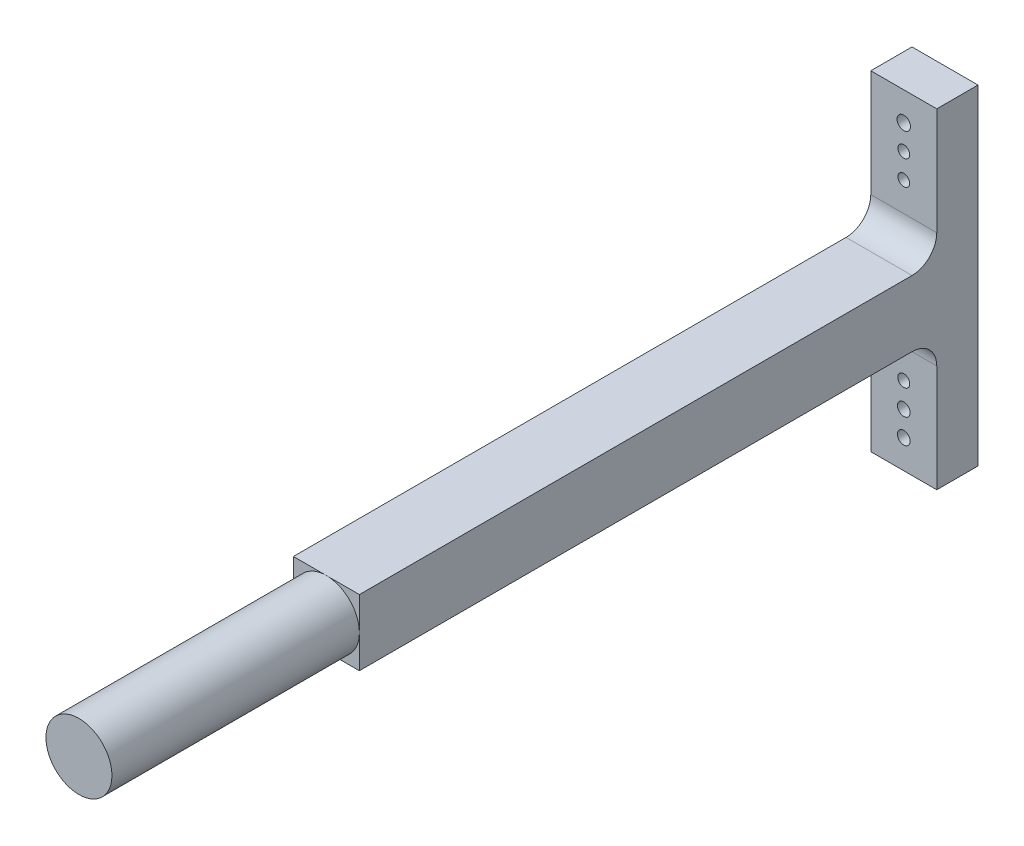
ISO-10303-21;
HEADER;
FILE_DESCRIPTION(('STEP AP214'),'2;1');
FILE_NAME('part.step','',(''),(''),'','','');
FILE_SCHEMA(('AUTOMOTIVE_DESIGN { 1 0 10303 214 1 1 1 1 }'));
ENDSEC;
DATA;
#1=APPLICATION_CONTEXT('core data for automotive mechanical design processes');
#2=APPLICATION_PROTOCOL_DEFINITION('international standard','automotive_design',2000,#1);
#3=PRODUCT_CONTEXT('',#1,'mechanical');
#4=PRODUCT('Part','Part','',(#3));
#5=PRODUCT_RELATED_PRODUCT_CATEGORY('part','',(#4));
#6=PRODUCT_DEFINITION_FORMATION('','',#4);
#7=PRODUCT_DEFINITION_CONTEXT('part definition',#1,'design');
#8=PRODUCT_DEFINITION('design','',#6,#7);
#9=PRODUCT_DEFINITION_SHAPE('','',#8);
#10=(LENGTH_UNIT() NAMED_UNIT(*) SI_UNIT(.MILLI.,.METRE.));
#11=(NAMED_UNIT(*) PLANE_ANGLE_UNIT() SI_UNIT($,.RADIAN.));
#12=(NAMED_UNIT(*) SI_UNIT($,.STERADIAN.) SOLID_ANGLE_UNIT());
#13=UNCERTAINTY_MEASURE_WITH_UNIT(LENGTH_MEASURE(1.E-05),#10,'distance_accuracy_value','');
#14=(GEOMETRIC_REPRESENTATION_CONTEXT(3) GLOBAL_UNCERTAINTY_ASSIGNED_CONTEXT((#13)) GLOBAL_UNIT_ASSIGNED_CONTEXT((#10,
#11,#12)) REPRESENTATION_CONTEXT('',''));
#15=CARTESIAN_POINT('',(0.,0.,0.));
#16=DIRECTION('',(0.,0.,1.));
#17=DIRECTION('',(1.,0.,0.));
#18=AXIS2_PLACEMENT_3D('',#15,#16,#17);
#19=CARTESIAN_POINT('',(0.,0.,75.));
#20=DIRECTION('',(0.,0.,1.));
#21=DIRECTION('',(1.,0.,0.));
#22=AXIS2_PLACEMENT_3D('',#19,#20,#21);
#23=PLANE('',#22);
#24=CARTESIAN_POINT('',(4.,20.,75.));
#25=DIRECTION('',(0.,0.,1.));
#26=DIRECTION('',(1.,0.,0.));
#27=AXIS2_PLACEMENT_3D('',#24,#25,#26);
#28=CIRCLE('',#27,4.);
#29=CARTESIAN_POINT('',(8.,20.,75.));
#30=VERTEX_POINT('',#29);
#31=CARTESIAN_POINT('',(4.,24.,75.));
#32=VERTEX_POINT('',#31);
#33=EDGE_CURVE('E142',#30,#32,#28,.T.);
#34=ORIENTED_EDGE('',*,*,#33,.F.);
#35=DIRECTION('',(0.,1.,0.));
#36=VECTOR('',#35,1.);
#37=CARTESIAN_POINT('',(8.,24.,75.));
#38=LINE('',#37,#36);
#39=CARTESIAN_POINT('',(8.,24.,75.));
#40=VERTEX_POINT('',#39);
#41=EDGE_CURVE('E130',#30,#40,#38,.T.);
#42=ORIENTED_EDGE('',*,*,#41,.T.);
#43=DIRECTION('',(-1.,0.,0.));
#44=VECTOR('',#43,1.);
#45=CARTESIAN_POINT('',(0.,24.,75.));
#46=LINE('',#45,#44);
#47=EDGE_CURVE('E143',#40,#32,#46,.T.);
#48=ORIENTED_EDGE('',*,*,#47,.T.);
#49=EDGE_LOOP('',(#34,#42,#48));
#50=FACE_BOUND('',#49,.T.);
#51=ADVANCED_FACE('F32',(#50),#23,.T.);
#52=CARTESIAN_POINT('',(0.,20.,75.));
#53=VERTEX_POINT('',#52);
#54=EDGE_CURVE('E149',#32,#53,#28,.T.);
#55=ORIENTED_EDGE('',*,*,#54,.F.);
#56=CARTESIAN_POINT('',(0.,24.,75.));
#57=VERTEX_POINT('',#56);
#58=EDGE_CURVE('E129',#32,#57,#46,.T.);
#59=ORIENTED_EDGE('',*,*,#58,.T.);
#60=DIRECTION('',(0.,-1.,0.));
#61=VECTOR('',#60,1.);
#62=CARTESIAN_POINT('',(0.,24.,75.));
#63=LINE('',#62,#61);
#64=EDGE_CURVE('E160',#57,#53,#63,.T.);
#65=ORIENTED_EDGE('',*,*,#64,.T.);
#66=EDGE_LOOP('',(#55,#59,#65));
#67=FACE_BOUND('',#66,.T.);
#68=ADVANCED_FACE('F273',(#67),#23,.T.);
#69=CARTESIAN_POINT('',(4.,16.,75.));
#70=VERTEX_POINT('',#69);
#71=EDGE_CURVE('E152',#53,#70,#28,.T.);
#72=ORIENTED_EDGE('',*,*,#71,.F.);
#73=CARTESIAN_POINT('',(0.,16.,75.));
#74=VERTEX_POINT('',#73);
#75=EDGE_CURVE('E163',#53,#74,#63,.T.);
#76=ORIENTED_EDGE('',*,*,#75,.T.);
#77=DIRECTION('',(1.,0.,0.));
#78=VECTOR('',#77,1.);
#79=CARTESIAN_POINT('',(0.,16.,75.));
#80=LINE('',#79,#78);
#81=EDGE_CURVE('E140',#74,#70,#80,.T.);
#82=ORIENTED_EDGE('',*,*,#81,.T.);
#83=EDGE_LOOP('',(#72,#76,#82));
#84=FACE_BOUND('',#83,.T.);
#85=ADVANCED_FACE('F289',(#84),#23,.T.);
#86=CARTESIAN_POINT('',(0.,0.,5.));
#87=DIRECTION('',(0.,0.,-1.));
#88=DIRECTION('',(-1.,0.,0.));
#89=AXIS2_PLACEMENT_3D('',#86,#87,#88);
#90=PLANE('',#89);
#91=CARTESIAN_POINT('',(3.99999999999987,30.5300000000001,5.));
#92=DIRECTION('',(0.,0.,1.));
#93=DIRECTION('',(1.,0.,0.));
#94=AXIS2_PLACEMENT_3D('',#91,#92,#93);
#95=CIRCLE('',#94,0.707209461962513);
#96=CARTESIAN_POINT('',(4.70720946196238,30.5300000000001,5.));
#97=VERTEX_POINT('',#96);
#98=EDGE_CURVE('E352',#97,#97,#95,.T.);
#99=ORIENTED_EDGE('',*,*,#98,.F.);
#100=EDGE_LOOP('',(#99));
#101=FACE_BOUND('',#100,.T.);
#102=CARTESIAN_POINT('',(3.99999999999984,33.5300000000001,5.));
#103=DIRECTION('',(0.,0.,1.));
#104=DIRECTION('',(1.,0.,0.));
#105=AXIS2_PLACEMENT_3D('',#102,#103,#104);
#106=CIRCLE('',#105,0.715862797432076);
#107=CARTESIAN_POINT('',(4.71586279743191,33.5300000000001,5.));
#108=VERTEX_POINT('',#107);
#109=EDGE_CURVE('E350',#108,#108,#106,.T.);
#110=ORIENTED_EDGE('',*,*,#109,.F.);
#111=EDGE_LOOP('',(#110));
#112=FACE_BOUND('',#111,.T.);
#113=CARTESIAN_POINT('',(3.99999999999981,36.5300000000001,5.));
#114=DIRECTION('',(0.,0.,1.));
#115=DIRECTION('',(1.,0.,0.));
#116=AXIS2_PLACEMENT_3D('',#113,#114,#115);
#117=CIRCLE('',#116,0.81261434625534);
#118=CARTESIAN_POINT('',(4.81261434625515,36.5300000000001,5.));
#119=VERTEX_POINT('',#118);
#120=EDGE_CURVE('E348',#119,#119,#117,.T.);
#121=ORIENTED_EDGE('',*,*,#120,.F.);
#122=EDGE_LOOP('',(#121));
#123=FACE_BOUND('',#122,.T.);
#124=DIRECTION('',(0.,-1.,0.));
#125=VECTOR('',#124,1.);
#126=CARTESIAN_POINT('',(0.,0.,5.));
#127=LINE('',#126,#125);
#128=CARTESIAN_POINT('',(0.,40.,5.));
#129=VERTEX_POINT('',#128);
#130=CARTESIAN_POINT('',(0.,27.,5.));
#131=VERTEX_POINT('',#130);
#132=EDGE_CURVE('E176',#129,#131,#127,.T.);
#133=ORIENTED_EDGE('',*,*,#132,.T.);
#134=DIRECTION('',(-1.,0.,0.));
#135=VECTOR('',#134,1.);
#136=CARTESIAN_POINT('',(8.,27.,5.));
#137=LINE('',#136,#135);
#138=CARTESIAN_POINT('',(8.,27.,5.));
#139=VERTEX_POINT('',#138);
#140=EDGE_CURVE('E53',#131,#139,#137,.F.);
#141=ORIENTED_EDGE('',*,*,#140,.T.);
#142=DIRECTION('',(0.,1.,0.));
#143=VECTOR('',#142,1.);
#144=CARTESIAN_POINT('',(8.,0.,5.));
#145=LINE('',#144,#143);
#146=CARTESIAN_POINT('',(8.,40.,5.));
#147=VERTEX_POINT('',#146);
#148=EDGE_CURVE('E181',#139,#147,#145,.T.);
#149=ORIENTED_EDGE('',*,*,#148,.T.);
#150=DIRECTION('',(-1.,0.,0.));
#151=VECTOR('',#150,1.);
#152=CARTESIAN_POINT('',(0.,40.,5.));
#153=LINE('',#152,#151);
#154=EDGE_CURVE('E185',#147,#129,#153,.T.);
#155=ORIENTED_EDGE('',*,*,#154,.T.);
#156=EDGE_LOOP('',(#133,#141,#149,#155));
#157=FACE_BOUND('',#156,.T.);
#158=ADVANCED_FACE('F263',(#101,#112,#123,#157),#90,.F.);
#159=CARTESIAN_POINT('',(4.00000000000015,3.47000000000006,5.));
#160=DIRECTION('',(0.,0.,1.));
#161=DIRECTION('',(1.,0.,0.));
#162=AXIS2_PLACEMENT_3D('',#159,#160,#161);
#163=CIRCLE('',#162,0.77356554783821);
#164=CARTESIAN_POINT('',(4.77356554783836,3.47000000000006,5.));
#165=VERTEX_POINT('',#164);
#166=EDGE_CURVE('E207',#165,#165,#163,.T.);
#167=ORIENTED_EDGE('',*,*,#166,.F.);
#168=EDGE_LOOP('',(#167));
#169=FACE_BOUND('',#168,.T.);
#170=CARTESIAN_POINT('',(4.00000000000012,6.47000000000006,5.));
#171=DIRECTION('',(0.,0.,1.));
#172=DIRECTION('',(1.,0.,0.));
#173=AXIS2_PLACEMENT_3D('',#170,#171,#172);
#174=CIRCLE('',#173,0.768304054392614);
#175=CARTESIAN_POINT('',(4.76830405439273,6.47000000000006,5.));
#176=VERTEX_POINT('',#175);
#177=EDGE_CURVE('E360',#176,#176,#174,.T.);
#178=ORIENTED_EDGE('',*,*,#177,.F.);
#179=EDGE_LOOP('',(#178));
#180=FACE_BOUND('',#179,.T.);
#181=CARTESIAN_POINT('',(4.00000000000009,9.47000000000006,5.));
#182=DIRECTION('',(0.,0.,1.));
#183=DIRECTION('',(1.,0.,0.));
#184=AXIS2_PLACEMENT_3D('',#181,#182,#183);
#185=CIRCLE('',#184,0.726526648407679);
#186=CARTESIAN_POINT('',(4.72652664840776,9.47000000000006,5.));
#187=VERTEX_POINT('',#186);
#188=EDGE_CURVE('E357',#187,#187,#185,.T.);
#189=ORIENTED_EDGE('',*,*,#188,.F.);
#190=EDGE_LOOP('',(#189));
#191=FACE_BOUND('',#190,.T.);
#192=CARTESIAN_POINT('',(8.,0.,5.));
#193=VERTEX_POINT('',#192);
#194=CARTESIAN_POINT('',(8.,13.,5.));
#195=VERTEX_POINT('',#194);
#196=EDGE_CURVE('E182',#193,#195,#145,.T.);
#197=ORIENTED_EDGE('',*,*,#196,.T.);
#198=DIRECTION('',(1.,0.,0.));
#199=VECTOR('',#198,1.);
#200=CARTESIAN_POINT('',(0.,13.,5.));
#201=LINE('',#200,#199);
#202=CARTESIAN_POINT('',(0.,13.,5.));
#203=VERTEX_POINT('',#202);
#204=EDGE_CURVE('E224',#195,#203,#201,.F.);
#205=ORIENTED_EDGE('',*,*,#204,.T.);
#206=CARTESIAN_POINT('',(0.,0.,5.));
#207=VERTEX_POINT('',#206);
#208=EDGE_CURVE('E179',#203,#207,#127,.T.);
#209=ORIENTED_EDGE('',*,*,#208,.T.);
#210=DIRECTION('',(1.,0.,0.));
#211=VECTOR('',#210,1.);
#212=CARTESIAN_POINT('',(0.,0.,5.));
#213=LINE('',#212,#211);
#214=EDGE_CURVE('E178',#207,#193,#213,.T.);
#215=ORIENTED_EDGE('',*,*,#214,.T.);
#216=EDGE_LOOP('',(#197,#205,#209,#215));
#217=FACE_BOUND('',#216,.T.);
#218=ADVANCED_FACE('F248',(#169,#180,#191,#217),#90,.F.);
#219=CARTESIAN_POINT('',(0.,0.,5.));
#220=DIRECTION('',(1.,0.,0.));
#221=DIRECTION('',(0.,0.,-1.));
#222=AXIS2_PLACEMENT_3D('',#219,#220,#221);
#223=PLANE('',#222);
#224=DIRECTION('',(0.,-1.,0.));
#225=VECTOR('',#224,1.);
#226=CARTESIAN_POINT('',(0.,0.,0.));
#227=LINE('',#226,#225);
#228=CARTESIAN_POINT('',(0.,40.,0.));
#229=VERTEX_POINT('',#228);
#230=CARTESIAN_POINT('',(0.,0.,0.));
#231=VERTEX_POINT('',#230);
#232=EDGE_CURVE('E175',#229,#231,#227,.T.);
#233=ORIENTED_EDGE('',*,*,#232,.T.);
#234=DIRECTION('',(0.,0.,-1.));
#235=VECTOR('',#234,1.);
#236=CARTESIAN_POINT('',(0.,0.,5.));
#237=LINE('',#236,#235);
#238=EDGE_CURVE('E153',#207,#231,#237,.T.);
#239=ORIENTED_EDGE('',*,*,#238,.F.);
#240=ORIENTED_EDGE('',*,*,#208,.F.);
#241=CARTESIAN_POINT('',(0.,13.,8.00000000000001));
#242=DIRECTION('',(1.,0.,0.));
#243=DIRECTION('',(0.,0.,-1.));
#244=AXIS2_PLACEMENT_3D('',#241,#242,#243);
#245=CIRCLE('',#244,3.);
#246=CARTESIAN_POINT('',(0.,16.,8.00000000000001));
#247=VERTEX_POINT('',#246);
#248=EDGE_CURVE('E232',#203,#247,#245,.T.);
#249=ORIENTED_EDGE('',*,*,#248,.T.);
#250=DIRECTION('',(0.,0.,-1.));
#251=VECTOR('',#250,1.);
#252=CARTESIAN_POINT('',(0.,16.,75.));
#253=LINE('',#252,#251);
#254=EDGE_CURVE('E172',#74,#247,#253,.T.);
#255=ORIENTED_EDGE('',*,*,#254,.F.);
#256=ORIENTED_EDGE('',*,*,#75,.F.);
#257=ORIENTED_EDGE('',*,*,#64,.F.);
#258=DIRECTION('',(0.,0.,-1.));
#259=VECTOR('',#258,1.);
#260=CARTESIAN_POINT('',(0.,24.,75.));
#261=LINE('',#260,#259);
#262=CARTESIAN_POINT('',(0.,24.,8.00000000000001));
#263=VERTEX_POINT('',#262);
#264=EDGE_CURVE('E167',#57,#263,#261,.T.);
#265=ORIENTED_EDGE('',*,*,#264,.T.);
#266=CARTESIAN_POINT('',(0.,27.,8.00000000000001));
#267=DIRECTION('',(1.,0.,0.));
#268=DIRECTION('',(0.,0.,-1.));
#269=AXIS2_PLACEMENT_3D('',#266,#267,#268);
#270=CIRCLE('',#269,3.);
#271=EDGE_CURVE('E40',#263,#131,#270,.T.);
#272=ORIENTED_EDGE('',*,*,#271,.T.);
#273=ORIENTED_EDGE('',*,*,#132,.F.);
#274=DIRECTION('',(0.,0.,-1.));
#275=VECTOR('',#274,1.);
#276=CARTESIAN_POINT('',(0.,40.,5.));
#277=LINE('',#276,#275);
#278=EDGE_CURVE('E187',#129,#229,#277,.T.);
#279=ORIENTED_EDGE('',*,*,#278,.T.);
#280=EDGE_LOOP('',(#233,#239,#240,#249,#255,#256,#257,#265,#272,#273,#279));
#281=FACE_BOUND('',#280,.T.);
#282=ADVANCED_FACE('F236',(#281),#223,.F.);
#283=CARTESIAN_POINT('',(0.,0.,5.));
#284=DIRECTION('',(0.,1.,0.));
#285=DIRECTION('',(0.,0.,1.));
#286=AXIS2_PLACEMENT_3D('',#283,#284,#285);
#287=PLANE('',#286);
#288=DIRECTION('',(1.,0.,0.));
#289=VECTOR('',#288,1.);
#290=CARTESIAN_POINT('',(0.,0.,0.));
#291=LINE('',#290,#289);
#292=CARTESIAN_POINT('',(8.,0.,0.));
#293=VERTEX_POINT('',#292);
#294=EDGE_CURVE('E190',#231,#293,#291,.T.);
#295=ORIENTED_EDGE('',*,*,#294,.T.);
#296=DIRECTION('',(0.,0.,-1.));
#297=VECTOR('',#296,1.);
#298=CARTESIAN_POINT('',(8.,0.,5.));
#299=LINE('',#298,#297);
#300=EDGE_CURVE('E155',#193,#293,#299,.T.);
#301=ORIENTED_EDGE('',*,*,#300,.F.);
#302=ORIENTED_EDGE('',*,*,#214,.F.);
#303=ORIENTED_EDGE('',*,*,#238,.T.);
#304=EDGE_LOOP('',(#295,#301,#302,#303));
#305=FACE_BOUND('',#304,.T.);
#306=ADVANCED_FACE('F252',(#305),#287,.F.);
#307=CARTESIAN_POINT('',(8.,0.,5.));
#308=DIRECTION('',(-1.,0.,0.));
#309=DIRECTION('',(0.,0.,1.));
#310=AXIS2_PLACEMENT_3D('',#307,#308,#309);
#311=PLANE('',#310);
#312=DIRECTION('',(0.,1.,0.));
#313=VECTOR('',#312,1.);
#314=CARTESIAN_POINT('',(8.,0.,0.));
#315=LINE('',#314,#313);
#316=CARTESIAN_POINT('',(8.,40.,0.));
#317=VERTEX_POINT('',#316);
#318=EDGE_CURVE('E192',#293,#317,#315,.T.);
#319=ORIENTED_EDGE('',*,*,#318,.T.);
#320=DIRECTION('',(0.,0.,-1.));
#321=VECTOR('',#320,1.);
#322=CARTESIAN_POINT('',(8.,40.,5.));
#323=LINE('',#322,#321);
#324=EDGE_CURVE('E198',#147,#317,#323,.T.);
#325=ORIENTED_EDGE('',*,*,#324,.F.);
#326=ORIENTED_EDGE('',*,*,#148,.F.);
#327=CARTESIAN_POINT('',(8.,27.,8.00000000000001));
#328=DIRECTION('',(-1.,0.,0.));
#329=DIRECTION('',(0.,0.,1.));
#330=AXIS2_PLACEMENT_3D('',#327,#328,#329);
#331=CIRCLE('',#330,3.);
#332=CARTESIAN_POINT('',(8.,24.,8.00000000000001));
#333=VERTEX_POINT('',#332);
#334=EDGE_CURVE('E11',#139,#333,#331,.T.);
#335=ORIENTED_EDGE('',*,*,#334,.T.);
#336=DIRECTION('',(0.,0.,-1.));
#337=VECTOR('',#336,1.);
#338=CARTESIAN_POINT('',(8.,24.,75.));
#339=LINE('',#338,#337);
#340=EDGE_CURVE('E136',#40,#333,#339,.T.);
#341=ORIENTED_EDGE('',*,*,#340,.F.);
#342=ORIENTED_EDGE('',*,*,#41,.F.);
#343=CARTESIAN_POINT('',(8.,16.,75.));
#344=VERTEX_POINT('',#343);
#345=EDGE_CURVE('E119',#344,#30,#38,.T.);
#346=ORIENTED_EDGE('',*,*,#345,.F.);
#347=DIRECTION('',(0.,0.,-1.));
#348=VECTOR('',#347,1.);
#349=CARTESIAN_POINT('',(8.,16.,75.));
#350=LINE('',#349,#348);
#351=CARTESIAN_POINT('',(8.,16.,8.00000000000001));
#352=VERTEX_POINT('',#351);
#353=EDGE_CURVE('E170',#344,#352,#350,.T.);
#354=ORIENTED_EDGE('',*,*,#353,.T.);
#355=CARTESIAN_POINT('',(8.,13.,8.00000000000001));
#356=DIRECTION('',(-1.,0.,0.));
#357=DIRECTION('',(0.,0.,1.));
#358=AXIS2_PLACEMENT_3D('',#355,#356,#357);
#359=CIRCLE('',#358,3.);
#360=EDGE_CURVE('E230',#352,#195,#359,.T.);
#361=ORIENTED_EDGE('',*,*,#360,.T.);
#362=ORIENTED_EDGE('',*,*,#196,.F.);
#363=ORIENTED_EDGE('',*,*,#300,.T.);
#364=EDGE_LOOP('',(#319,#325,#326,#335,#341,#342,#346,#354,#361,#362,#363));
#365=FACE_BOUND('',#364,.T.);
#366=ADVANCED_FACE('F134',(#365),#311,.F.);
#367=CARTESIAN_POINT('',(0.,40.,5.));
#368=DIRECTION('',(0.,-1.,0.));
#369=DIRECTION('',(0.,0.,-1.));
#370=AXIS2_PLACEMENT_3D('',#367,#368,#369);
#371=PLANE('',#370);
#372=DIRECTION('',(-1.,0.,0.));
#373=VECTOR('',#372,1.);
#374=CARTESIAN_POINT('',(0.,40.,0.));
#375=LINE('',#374,#373);
#376=EDGE_CURVE('E194',#317,#229,#375,.T.);
#377=ORIENTED_EDGE('',*,*,#376,.T.);
#378=ORIENTED_EDGE('',*,*,#278,.F.);
#379=ORIENTED_EDGE('',*,*,#154,.F.);
#380=ORIENTED_EDGE('',*,*,#324,.T.);
#381=EDGE_LOOP('',(#377,#378,#379,#380));
#382=FACE_BOUND('',#381,.T.);
#383=ADVANCED_FACE('F261',(#382),#371,.F.);
#384=CARTESIAN_POINT('',(0.,0.,0.));
#385=DIRECTION('',(0.,0.,-1.));
#386=DIRECTION('',(-1.,0.,0.));
#387=AXIS2_PLACEMENT_3D('',#384,#385,#386);
#388=PLANE('',#387);
#389=CARTESIAN_POINT('',(4.00000000000015,3.47000000000006,0.));
#390=DIRECTION('',(0.,0.,-1.));
#391=DIRECTION('',(-1.,0.,0.));
#392=AXIS2_PLACEMENT_3D('',#389,#390,#391);
#393=CIRCLE('',#392,0.77356554783821);
#394=CARTESIAN_POINT('',(3.22643445216194,3.47000000000006,0.));
#395=VERTEX_POINT('',#394);
#396=EDGE_CURVE('E147',#395,#395,#393,.T.);
#397=ORIENTED_EDGE('',*,*,#396,.F.);
#398=EDGE_LOOP('',(#397));
#399=FACE_BOUND('',#398,.T.);
#400=CARTESIAN_POINT('',(4.00000000000012,6.47000000000006,0.));
#401=DIRECTION('',(0.,0.,-1.));
#402=DIRECTION('',(-1.,0.,0.));
#403=AXIS2_PLACEMENT_3D('',#400,#401,#402);
#404=CIRCLE('',#403,0.768304054392614);
#405=CARTESIAN_POINT('',(3.2316959456075,6.47000000000006,0.));
#406=VERTEX_POINT('',#405);
#407=EDGE_CURVE('E216',#406,#406,#404,.T.);
#408=ORIENTED_EDGE('',*,*,#407,.F.);
#409=EDGE_LOOP('',(#408));
#410=FACE_BOUND('',#409,.T.);
#411=CARTESIAN_POINT('',(4.00000000000009,9.47000000000006,0.));
#412=DIRECTION('',(0.,0.,-1.));
#413=DIRECTION('',(-1.,0.,0.));
#414=AXIS2_PLACEMENT_3D('',#411,#412,#413);
#415=CIRCLE('',#414,0.726526648407679);
#416=CARTESIAN_POINT('',(3.27347335159241,9.47000000000006,0.));
#417=VERTEX_POINT('',#416);
#418=EDGE_CURVE('E213',#417,#417,#415,.T.);
#419=ORIENTED_EDGE('',*,*,#418,.F.);
#420=EDGE_LOOP('',(#419));
#421=FACE_BOUND('',#420,.T.);
#422=CARTESIAN_POINT('',(3.99999999999987,30.5300000000001,0.));
#423=DIRECTION('',(0.,0.,-1.));
#424=DIRECTION('',(-1.,0.,0.));
#425=AXIS2_PLACEMENT_3D('',#422,#423,#424);
#426=CIRCLE('',#425,0.707209461962513);
#427=CARTESIAN_POINT('',(3.29279053803736,30.5300000000001,0.));
#428=VERTEX_POINT('',#427);
#429=EDGE_CURVE('E210',#428,#428,#426,.T.);
#430=ORIENTED_EDGE('',*,*,#429,.F.);
#431=EDGE_LOOP('',(#430));
#432=FACE_BOUND('',#431,.T.);
#433=CARTESIAN_POINT('',(3.99999999999984,33.5300000000001,0.));
#434=DIRECTION('',(0.,0.,-1.));
#435=DIRECTION('',(-1.,0.,0.));
#436=AXIS2_PLACEMENT_3D('',#433,#434,#435);
#437=CIRCLE('',#436,0.715862797432076);
#438=CARTESIAN_POINT('',(3.28413720256776,33.5300000000001,0.));
#439=VERTEX_POINT('',#438);
#440=EDGE_CURVE('E206',#439,#439,#437,.T.);
#441=ORIENTED_EDGE('',*,*,#440,.F.);
#442=EDGE_LOOP('',(#441));
#443=FACE_BOUND('',#442,.T.);
#444=CARTESIAN_POINT('',(3.99999999999981,36.5300000000001,0.));
#445=DIRECTION('',(0.,0.,-1.));
#446=DIRECTION('',(-1.,0.,0.));
#447=AXIS2_PLACEMENT_3D('',#444,#445,#446);
#448=CIRCLE('',#447,0.81261434625534);
#449=CARTESIAN_POINT('',(3.18738565374447,36.5300000000001,0.));
#450=VERTEX_POINT('',#449);
#451=EDGE_CURVE('E203',#450,#450,#448,.T.);
#452=ORIENTED_EDGE('',*,*,#451,.F.);
#453=EDGE_LOOP('',(#452));
#454=FACE_BOUND('',#453,.T.);
#455=ORIENTED_EDGE('',*,*,#232,.F.);
#456=ORIENTED_EDGE('',*,*,#376,.F.);
#457=ORIENTED_EDGE('',*,*,#318,.F.);
#458=ORIENTED_EDGE('',*,*,#294,.F.);
#459=EDGE_LOOP('',(#455,#456,#457,#458));
#460=FACE_BOUND('',#459,.T.);
#461=ADVANCED_FACE('F258',(#399,#410,#421,#432,#443,#454,#460),#388,.T.);
#462=CARTESIAN_POINT('',(0.,16.,75.));
#463=DIRECTION('',(0.,1.,0.));
#464=DIRECTION('',(0.,0.,1.));
#465=AXIS2_PLACEMENT_3D('',#462,#463,#464);
#466=PLANE('',#465);
#467=ORIENTED_EDGE('',*,*,#254,.T.);
#468=DIRECTION('',(1.,0.,0.));
#469=VECTOR('',#468,1.);
#470=CARTESIAN_POINT('',(8.,16.,8.00000000000001));
#471=LINE('',#470,#469);
#472=EDGE_CURVE('E221',#247,#352,#471,.T.);
#473=ORIENTED_EDGE('',*,*,#472,.T.);
#474=ORIENTED_EDGE('',*,*,#353,.F.);
#475=EDGE_CURVE('E125',#70,#344,#80,.T.);
#476=ORIENTED_EDGE('',*,*,#475,.F.);
#477=ORIENTED_EDGE('',*,*,#81,.F.);
#478=EDGE_LOOP('',(#467,#473,#474,#476,#477));
#479=FACE_BOUND('',#478,.T.);
#480=ADVANCED_FACE('F244',(#479),#466,.F.);
#481=CARTESIAN_POINT('',(0.,24.,75.));
#482=DIRECTION('',(0.,-1.,0.));
#483=DIRECTION('',(0.,0.,-1.));
#484=AXIS2_PLACEMENT_3D('',#481,#482,#483);
#485=PLANE('',#484);
#486=ORIENTED_EDGE('',*,*,#340,.T.);
#487=DIRECTION('',(-1.,0.,0.));
#488=VECTOR('',#487,1.);
#489=CARTESIAN_POINT('',(0.,24.,8.00000000000001));
#490=LINE('',#489,#488);
#491=EDGE_CURVE('E226',#333,#263,#490,.T.);
#492=ORIENTED_EDGE('',*,*,#491,.T.);
#493=ORIENTED_EDGE('',*,*,#264,.F.);
#494=ORIENTED_EDGE('',*,*,#58,.F.);
#495=ORIENTED_EDGE('',*,*,#47,.F.);
#496=EDGE_LOOP('',(#486,#492,#493,#494,#495));
#497=FACE_BOUND('',#496,.T.);
#498=ADVANCED_FACE('F268',(#497),#485,.F.);
#499=EDGE_CURVE('E123',#70,#30,#28,.T.);
#500=ORIENTED_EDGE('',*,*,#499,.F.);
#501=ORIENTED_EDGE('',*,*,#475,.T.);
#502=ORIENTED_EDGE('',*,*,#345,.T.);
#503=EDGE_LOOP('',(#500,#501,#502));
#504=FACE_BOUND('',#503,.T.);
#505=ADVANCED_FACE('F121',(#504),#23,.T.);
#506=CARTESIAN_POINT('',(4.,20.,105.));
#507=DIRECTION('',(0.,0.,-1.));
#508=DIRECTION('',(-1.,0.,0.));
#509=AXIS2_PLACEMENT_3D('',#506,#507,#508);
#510=CYLINDRICAL_SURFACE('',#509,4.);
#511=CARTESIAN_POINT('',(4.,20.,105.));
#512=DIRECTION('',(0.,0.,1.));
#513=DIRECTION('',(1.,0.,0.));
#514=AXIS2_PLACEMENT_3D('',#511,#512,#513);
#515=CIRCLE('',#514,4.);
#516=CARTESIAN_POINT('',(8.,20.,105.));
#517=VERTEX_POINT('',#516);
#518=EDGE_CURVE('E146',#517,#517,#515,.T.);
#519=ORIENTED_EDGE('',*,*,#518,.F.);
#520=EDGE_LOOP('',(#519));
#521=FACE_BOUND('',#520,.T.);
#522=ORIENTED_EDGE('',*,*,#33,.T.);
#523=ORIENTED_EDGE('',*,*,#54,.T.);
#524=ORIENTED_EDGE('',*,*,#71,.T.);
#525=ORIENTED_EDGE('',*,*,#499,.T.);
#526=EDGE_LOOP('',(#522,#523,#524,#525));
#527=FACE_BOUND('',#526,.T.);
#528=ADVANCED_FACE('F151',(#521,#527),#510,.T.);
#529=CARTESIAN_POINT('',(4.,20.,105.));
#530=DIRECTION('',(0.,0.,1.));
#531=DIRECTION('',(1.,0.,0.));
#532=AXIS2_PLACEMENT_3D('',#529,#530,#531);
#533=PLANE('',#532);
#534=ORIENTED_EDGE('',*,*,#518,.T.);
#535=EDGE_LOOP('',(#534));
#536=FACE_BOUND('',#535,.T.);
#537=ADVANCED_FACE('F278',(#536),#533,.T.);
#538=CARTESIAN_POINT('',(3.99999999999981,36.5300000000001,-5.));
#539=DIRECTION('',(0.,0.,1.));
#540=DIRECTION('',(1.,0.,0.));
#541=AXIS2_PLACEMENT_3D('',#538,#539,#540);
#542=CYLINDRICAL_SURFACE('',#541,0.81261434625534);
#543=ORIENTED_EDGE('',*,*,#451,.T.);
#544=EDGE_LOOP('',(#543));
#545=FACE_BOUND('',#544,.T.);
#546=ORIENTED_EDGE('',*,*,#120,.T.);
#547=EDGE_LOOP('',(#546));
#548=FACE_BOUND('',#547,.T.);
#549=ADVANCED_FACE('F286',(#545,#548),#542,.F.);
#550=CARTESIAN_POINT('',(3.99999999999984,33.5300000000001,-5.));
#551=DIRECTION('',(0.,0.,1.));
#552=DIRECTION('',(1.,0.,0.));
#553=AXIS2_PLACEMENT_3D('',#550,#551,#552);
#554=CYLINDRICAL_SURFACE('',#553,0.715862797432076);
#555=ORIENTED_EDGE('',*,*,#440,.T.);
#556=EDGE_LOOP('',(#555));
#557=FACE_BOUND('',#556,.T.);
#558=ORIENTED_EDGE('',*,*,#109,.T.);
#559=EDGE_LOOP('',(#558));
#560=FACE_BOUND('',#559,.T.);
#561=ADVANCED_FACE('F335',(#557,#560),#554,.F.);
#562=CARTESIAN_POINT('',(3.99999999999987,30.5300000000001,-5.));
#563=DIRECTION('',(0.,0.,1.));
#564=DIRECTION('',(1.,0.,0.));
#565=AXIS2_PLACEMENT_3D('',#562,#563,#564);
#566=CYLINDRICAL_SURFACE('',#565,0.707209461962513);
#567=ORIENTED_EDGE('',*,*,#429,.T.);
#568=EDGE_LOOP('',(#567));
#569=FACE_BOUND('',#568,.T.);
#570=ORIENTED_EDGE('',*,*,#98,.T.);
#571=EDGE_LOOP('',(#570));
#572=FACE_BOUND('',#571,.T.);
#573=ADVANCED_FACE('F331',(#569,#572),#566,.F.);
#574=CARTESIAN_POINT('',(4.00000000000009,9.47000000000006,-5.));
#575=DIRECTION('',(0.,0.,1.));
#576=DIRECTION('',(1.,0.,0.));
#577=AXIS2_PLACEMENT_3D('',#574,#575,#576);
#578=CYLINDRICAL_SURFACE('',#577,0.726526648407679);
#579=ORIENTED_EDGE('',*,*,#418,.T.);
#580=EDGE_LOOP('',(#579));
#581=FACE_BOUND('',#580,.T.);
#582=ORIENTED_EDGE('',*,*,#188,.T.);
#583=EDGE_LOOP('',(#582));
#584=FACE_BOUND('',#583,.T.);
#585=ADVANCED_FACE('F324',(#581,#584),#578,.F.);
#586=CARTESIAN_POINT('',(4.00000000000012,6.47000000000006,-5.));
#587=DIRECTION('',(0.,0.,1.));
#588=DIRECTION('',(1.,0.,0.));
#589=AXIS2_PLACEMENT_3D('',#586,#587,#588);
#590=CYLINDRICAL_SURFACE('',#589,0.768304054392614);
#591=ORIENTED_EDGE('',*,*,#407,.T.);
#592=EDGE_LOOP('',(#591));
#593=FACE_BOUND('',#592,.T.);
#594=ORIENTED_EDGE('',*,*,#177,.T.);
#595=EDGE_LOOP('',(#594));
#596=FACE_BOUND('',#595,.T.);
#597=ADVANCED_FACE('F318',(#593,#596),#590,.F.);
#598=CARTESIAN_POINT('',(4.00000000000015,3.47000000000006,-5.));
#599=DIRECTION('',(0.,0.,1.));
#600=DIRECTION('',(1.,0.,0.));
#601=AXIS2_PLACEMENT_3D('',#598,#599,#600);
#602=CYLINDRICAL_SURFACE('',#601,0.77356554783821);
#603=ORIENTED_EDGE('',*,*,#396,.T.);
#604=EDGE_LOOP('',(#603));
#605=FACE_BOUND('',#604,.T.);
#606=ORIENTED_EDGE('',*,*,#166,.T.);
#607=EDGE_LOOP('',(#606));
#608=FACE_BOUND('',#607,.T.);
#609=ADVANCED_FACE('F313',(#605,#608),#602,.F.);
#610=CARTESIAN_POINT('',(0.,13.,8.00000000000001));
#611=DIRECTION('',(-1.,0.,0.));
#612=DIRECTION('',(0.,0.,1.));
#613=AXIS2_PLACEMENT_3D('',#610,#611,#612);
#614=CYLINDRICAL_SURFACE('',#613,3.);
#615=ORIENTED_EDGE('',*,*,#248,.F.);
#616=ORIENTED_EDGE('',*,*,#204,.F.);
#617=ORIENTED_EDGE('',*,*,#360,.F.);
#618=ORIENTED_EDGE('',*,*,#472,.F.);
#619=EDGE_LOOP('',(#615,#616,#617,#618));
#620=FACE_BOUND('',#619,.T.);
#621=ADVANCED_FACE('F245',(#620),#614,.F.);
#622=CARTESIAN_POINT('',(0.,27.,8.00000000000001));
#623=DIRECTION('',(1.,0.,0.));
#624=DIRECTION('',(0.,0.,-1.));
#625=AXIS2_PLACEMENT_3D('',#622,#623,#624);
#626=CYLINDRICAL_SURFACE('',#625,3.);
#627=ORIENTED_EDGE('',*,*,#334,.F.);
#628=ORIENTED_EDGE('',*,*,#140,.F.);
#629=ORIENTED_EDGE('',*,*,#271,.F.);
#630=ORIENTED_EDGE('',*,*,#491,.F.);
#631=EDGE_LOOP('',(#627,#628,#629,#630));
#632=FACE_BOUND('',#631,.T.);
#633=ADVANCED_FACE('F34',(#632),#626,.F.);
#634=CLOSED_SHELL('',(#51,#68,#85,#158,#218,#282,#306,#366,#383,#461,#480,#498,#505,#528,#537,
#549,#561,#573,#585,#597,#609,#621,#633));
#635=MANIFOLD_SOLID_BREP('B2',#634);
#636=ADVANCED_BREP_SHAPE_REPRESENTATION('',(#18,#635),#14);
#637=SHAPE_DEFINITION_REPRESENTATION(#9,#636);
ENDSEC;
END-ISO-10303-21;
